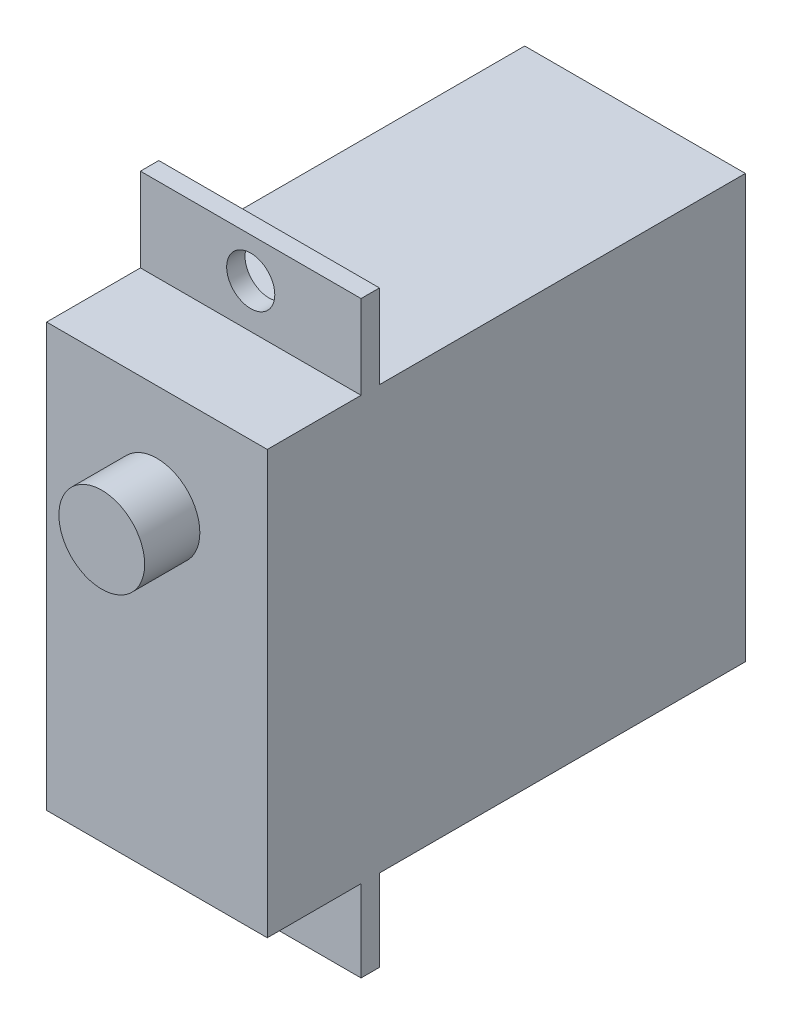
ISO-10303-21;
HEADER;
FILE_DESCRIPTION(('STEP AP214'),'2;1');
FILE_NAME('part.step','',(''),(''),'','','');
FILE_SCHEMA(('AUTOMOTIVE_DESIGN { 1 0 10303 214 1 1 1 1 }'));
ENDSEC;
DATA;
#1=APPLICATION_CONTEXT('core data for automotive mechanical design processes');
#2=APPLICATION_PROTOCOL_DEFINITION('international standard','automotive_design',2000,#1);
#3=PRODUCT_CONTEXT('',#1,'mechanical');
#4=PRODUCT('Part','Part','',(#3));
#5=PRODUCT_RELATED_PRODUCT_CATEGORY('part','',(#4));
#6=PRODUCT_DEFINITION_FORMATION('','',#4);
#7=PRODUCT_DEFINITION_CONTEXT('part definition',#1,'design');
#8=PRODUCT_DEFINITION('design','',#6,#7);
#9=PRODUCT_DEFINITION_SHAPE('','',#8);
#10=(LENGTH_UNIT() NAMED_UNIT(*) SI_UNIT(.MILLI.,.METRE.));
#11=(NAMED_UNIT(*) PLANE_ANGLE_UNIT() SI_UNIT($,.RADIAN.));
#12=(NAMED_UNIT(*) SI_UNIT($,.STERADIAN.) SOLID_ANGLE_UNIT());
#13=UNCERTAINTY_MEASURE_WITH_UNIT(LENGTH_MEASURE(1.E-05),#10,'distance_accuracy_value','');
#14=(GEOMETRIC_REPRESENTATION_CONTEXT(3) GLOBAL_UNCERTAINTY_ASSIGNED_CONTEXT((#13)) GLOBAL_UNIT_ASSIGNED_CONTEXT((#10,
#11,#12)) REPRESENTATION_CONTEXT('',''));
#15=CARTESIAN_POINT('',(0.,0.,0.));
#16=DIRECTION('',(0.,0.,1.));
#17=DIRECTION('',(1.,0.,0.));
#18=AXIS2_PLACEMENT_3D('',#15,#16,#17);
#19=CARTESIAN_POINT('',(-1.4678769771413,-9.63687150837989,26.));
#20=DIRECTION('',(0.,1.,0.));
#21=DIRECTION('',(-1.,0.,0.));
#22=AXIS2_PLACEMENT_3D('',#19,#20,#21);
#23=PLANE('',#22);
#24=DIRECTION('',(0.,0.,-1.));
#25=VECTOR('',#24,1.);
#26=CARTESIAN_POINT('',(10.5321230228587,-9.63687150837989,26.));
#27=LINE('',#26,#25);
#28=CARTESIAN_POINT('',(10.5321230228587,-9.63687150837989,19.9));
#29=VERTEX_POINT('',#28);
#30=CARTESIAN_POINT('',(10.5321230228587,-9.63687150837989,0.));
#31=VERTEX_POINT('',#30);
#32=EDGE_CURVE('E57',#29,#31,#27,.T.);
#33=ORIENTED_EDGE('',*,*,#32,.F.);
#34=DIRECTION('',(-1.,0.,0.));
#35=VECTOR('',#34,1.);
#36=CARTESIAN_POINT('',(-1.4678769771413,-9.63687150837989,19.9));
#37=LINE('',#36,#35);
#38=CARTESIAN_POINT('',(-1.46787697714129,-9.63687150837989,19.9));
#39=VERTEX_POINT('',#38);
#40=EDGE_CURVE('E170',#29,#39,#37,.T.);
#41=ORIENTED_EDGE('',*,*,#40,.T.);
#42=DIRECTION('',(0.,0.,-1.));
#43=VECTOR('',#42,1.);
#44=CARTESIAN_POINT('',(-1.4678769771413,-9.63687150837989,26.));
#45=LINE('',#44,#43);
#46=CARTESIAN_POINT('',(-1.4678769771413,-9.63687150837989,0.));
#47=VERTEX_POINT('',#46);
#48=EDGE_CURVE('E206',#39,#47,#45,.T.);
#49=ORIENTED_EDGE('',*,*,#48,.T.);
#50=DIRECTION('',(1.,0.,0.));
#51=VECTOR('',#50,1.);
#52=CARTESIAN_POINT('',(-1.4678769771413,-9.63687150837989,0.));
#53=LINE('',#52,#51);
#54=EDGE_CURVE('E192',#47,#31,#53,.T.);
#55=ORIENTED_EDGE('',*,*,#54,.T.);
#56=EDGE_LOOP('',(#33,#41,#49,#55));
#57=FACE_BOUND('',#56,.T.);
#58=ADVANCED_FACE('F33',(#57),#23,.F.);
#59=CARTESIAN_POINT('',(-1.4678769771413,13.3631284916201,26.));
#60=DIRECTION('',(0.,-1.,0.));
#61=DIRECTION('',(0.,0.,-1.));
#62=AXIS2_PLACEMENT_3D('',#59,#60,#61);
#63=PLANE('',#62);
#64=DIRECTION('',(0.,0.,-1.));
#65=VECTOR('',#64,1.);
#66=CARTESIAN_POINT('',(-1.4678769771413,13.3631284916201,26.));
#67=LINE('',#66,#65);
#68=CARTESIAN_POINT('',(-1.4678769771413,13.3631284916201,19.9));
#69=VERTEX_POINT('',#68);
#70=CARTESIAN_POINT('',(-1.4678769771413,13.3631284916201,0.));
#71=VERTEX_POINT('',#70);
#72=EDGE_CURVE('E189',#69,#71,#67,.T.);
#73=ORIENTED_EDGE('',*,*,#72,.F.);
#74=DIRECTION('',(1.,0.,0.));
#75=VECTOR('',#74,1.);
#76=CARTESIAN_POINT('',(-1.4678769771413,13.3631284916201,19.9));
#77=LINE('',#76,#75);
#78=CARTESIAN_POINT('',(10.5321230228587,13.3631284916201,19.9));
#79=VERTEX_POINT('',#78);
#80=EDGE_CURVE('E11',#69,#79,#77,.T.);
#81=ORIENTED_EDGE('',*,*,#80,.T.);
#82=DIRECTION('',(0.,0.,-1.));
#83=VECTOR('',#82,1.);
#84=CARTESIAN_POINT('',(10.5321230228587,13.3631284916201,26.));
#85=LINE('',#84,#83);
#86=CARTESIAN_POINT('',(10.5321230228587,13.3631284916201,0.));
#87=VERTEX_POINT('',#86);
#88=EDGE_CURVE('E132',#79,#87,#85,.T.);
#89=ORIENTED_EDGE('',*,*,#88,.T.);
#90=DIRECTION('',(-1.,0.,0.));
#91=VECTOR('',#90,1.);
#92=CARTESIAN_POINT('',(-1.4678769771413,13.3631284916201,0.));
#93=LINE('',#92,#91);
#94=EDGE_CURVE('E183',#87,#71,#93,.T.);
#95=ORIENTED_EDGE('',*,*,#94,.T.);
#96=EDGE_LOOP('',(#73,#81,#89,#95));
#97=FACE_BOUND('',#96,.T.);
#98=ADVANCED_FACE('F226',(#97),#63,.F.);
#99=CARTESIAN_POINT('',(-1.4678769771413,13.3631284916201,26.));
#100=DIRECTION('',(1.,0.,0.));
#101=DIRECTION('',(0.,1.,0.));
#102=AXIS2_PLACEMENT_3D('',#99,#100,#101);
#103=PLANE('',#102);
#104=CARTESIAN_POINT('',(-1.4678769771413,13.3631284916201,26.));
#105=VERTEX_POINT('',#104);
#106=CARTESIAN_POINT('',(-1.4678769771413,13.3631284916201,20.9));
#107=VERTEX_POINT('',#106);
#108=EDGE_CURVE('E198',#105,#107,#67,.T.);
#109=ORIENTED_EDGE('',*,*,#108,.T.);
#110=DIRECTION('',(0.,1.,0.));
#111=VECTOR('',#110,1.);
#112=CARTESIAN_POINT('',(-1.4678769771413,17.9199885826736,20.9));
#113=LINE('',#112,#111);
#114=CARTESIAN_POINT('',(-1.4678769771413,17.9199885826736,20.9));
#115=VERTEX_POINT('',#114);
#116=EDGE_CURVE('E161',#107,#115,#113,.T.);
#117=ORIENTED_EDGE('',*,*,#116,.T.);
#118=DIRECTION('',(0.,0.,-1.));
#119=VECTOR('',#118,1.);
#120=CARTESIAN_POINT('',(-1.4678769771413,17.9199885826736,20.9));
#121=LINE('',#120,#119);
#122=CARTESIAN_POINT('',(-1.4678769771413,17.9199885826736,19.9));
#123=VERTEX_POINT('',#122);
#124=EDGE_CURVE('E166',#115,#123,#121,.T.);
#125=ORIENTED_EDGE('',*,*,#124,.T.);
#126=DIRECTION('',(0.,-1.,0.));
#127=VECTOR('',#126,1.);
#128=CARTESIAN_POINT('',(-1.4678769771413,17.9199885826736,19.9));
#129=LINE('',#128,#127);
#130=EDGE_CURVE('E141',#123,#69,#129,.T.);
#131=ORIENTED_EDGE('',*,*,#130,.T.);
#132=ORIENTED_EDGE('',*,*,#72,.T.);
#133=DIRECTION('',(0.,-1.,0.));
#134=VECTOR('',#133,1.);
#135=CARTESIAN_POINT('',(-1.4678769771413,13.3631284916201,0.));
#136=LINE('',#135,#134);
#137=EDGE_CURVE('E176',#71,#47,#136,.T.);
#138=ORIENTED_EDGE('',*,*,#137,.T.);
#139=ORIENTED_EDGE('',*,*,#48,.F.);
#140=CARTESIAN_POINT('',(-1.4678769771413,-14.0800114173264,19.9));
#141=VERTEX_POINT('',#140);
#142=EDGE_CURVE('E224',#39,#141,#129,.T.);
#143=ORIENTED_EDGE('',*,*,#142,.T.);
#144=DIRECTION('',(0.,0.,1.));
#145=VECTOR('',#144,1.);
#146=CARTESIAN_POINT('',(-1.4678769771413,-14.0800114173264,20.9));
#147=LINE('',#146,#145);
#148=CARTESIAN_POINT('',(-1.46787697714129,-14.0800114173264,20.9));
#149=VERTEX_POINT('',#148);
#150=EDGE_CURVE('E239',#141,#149,#147,.T.);
#151=ORIENTED_EDGE('',*,*,#150,.T.);
#152=CARTESIAN_POINT('',(-1.4678769771413,-9.63687150837989,20.9));
#153=VERTEX_POINT('',#152);
#154=EDGE_CURVE('E240',#149,#153,#113,.T.);
#155=ORIENTED_EDGE('',*,*,#154,.T.);
#156=CARTESIAN_POINT('',(-1.4678769771413,-9.63687150837989,26.));
#157=VERTEX_POINT('',#156);
#158=EDGE_CURVE('E49',#157,#153,#45,.T.);
#159=ORIENTED_EDGE('',*,*,#158,.F.);
#160=DIRECTION('',(0.,-1.,0.));
#161=VECTOR('',#160,1.);
#162=CARTESIAN_POINT('',(-1.4678769771413,13.3631284916201,26.));
#163=LINE('',#162,#161);
#164=EDGE_CURVE('E179',#105,#157,#163,.T.);
#165=ORIENTED_EDGE('',*,*,#164,.F.);
#166=EDGE_LOOP('',(#109,#117,#125,#131,#132,#138,#139,#143,#151,#155,#159,#165));
#167=FACE_BOUND('',#166,.T.);
#168=ADVANCED_FACE('F35',(#167),#103,.F.);
#169=ORIENTED_EDGE('',*,*,#158,.T.);
#170=DIRECTION('',(1.,0.,0.));
#171=VECTOR('',#170,1.);
#172=CARTESIAN_POINT('',(-1.4678769771413,-9.63687150837989,20.9));
#173=LINE('',#172,#171);
#174=CARTESIAN_POINT('',(10.5321230228587,-9.63687150837989,20.9));
#175=VERTEX_POINT('',#174);
#176=EDGE_CURVE('E168',#153,#175,#173,.T.);
#177=ORIENTED_EDGE('',*,*,#176,.T.);
#178=CARTESIAN_POINT('',(10.5321230228587,-9.63687150837989,26.));
#179=VERTEX_POINT('',#178);
#180=EDGE_CURVE('E204',#179,#175,#27,.T.);
#181=ORIENTED_EDGE('',*,*,#180,.F.);
#182=DIRECTION('',(1.,0.,0.));
#183=VECTOR('',#182,1.);
#184=CARTESIAN_POINT('',(-1.4678769771413,-9.63687150837989,26.));
#185=LINE('',#184,#183);
#186=EDGE_CURVE('E182',#157,#179,#185,.T.);
#187=ORIENTED_EDGE('',*,*,#186,.F.);
#188=EDGE_LOOP('',(#169,#177,#181,#187));
#189=FACE_BOUND('',#188,.T.);
#190=ADVANCED_FACE('F273',(#189),#23,.F.);
#191=CARTESIAN_POINT('',(10.5321230228587,13.3631284916201,26.));
#192=DIRECTION('',(-1.,0.,0.));
#193=DIRECTION('',(0.,0.,1.));
#194=AXIS2_PLACEMENT_3D('',#191,#192,#193);
#195=PLANE('',#194);
#196=ORIENTED_EDGE('',*,*,#180,.T.);
#197=DIRECTION('',(0.,-1.,0.));
#198=VECTOR('',#197,1.);
#199=CARTESIAN_POINT('',(10.5321230228587,17.9199885826736,20.9));
#200=LINE('',#199,#198);
#201=CARTESIAN_POINT('',(10.5321230228587,-14.0800114173264,20.9));
#202=VERTEX_POINT('',#201);
#203=EDGE_CURVE('E150',#175,#202,#200,.T.);
#204=ORIENTED_EDGE('',*,*,#203,.T.);
#205=DIRECTION('',(0.,0.,-1.));
#206=VECTOR('',#205,1.);
#207=CARTESIAN_POINT('',(10.5321230228587,-14.0800114173264,20.9));
#208=LINE('',#207,#206);
#209=CARTESIAN_POINT('',(10.5321230228587,-14.0800114173264,19.9));
#210=VERTEX_POINT('',#209);
#211=EDGE_CURVE('E145',#202,#210,#208,.T.);
#212=ORIENTED_EDGE('',*,*,#211,.T.);
#213=DIRECTION('',(0.,1.,0.));
#214=VECTOR('',#213,1.);
#215=CARTESIAN_POINT('',(10.5321230228587,17.9199885826736,19.9));
#216=LINE('',#215,#214);
#217=EDGE_CURVE('E135',#210,#29,#216,.T.);
#218=ORIENTED_EDGE('',*,*,#217,.T.);
#219=ORIENTED_EDGE('',*,*,#32,.T.);
#220=DIRECTION('',(0.,1.,0.));
#221=VECTOR('',#220,1.);
#222=CARTESIAN_POINT('',(10.5321230228587,13.3631284916201,0.));
#223=LINE('',#222,#221);
#224=EDGE_CURVE('E194',#31,#87,#223,.T.);
#225=ORIENTED_EDGE('',*,*,#224,.T.);
#226=ORIENTED_EDGE('',*,*,#88,.F.);
#227=CARTESIAN_POINT('',(10.5321230228587,17.9199885826736,19.9));
#228=VERTEX_POINT('',#227);
#229=EDGE_CURVE('E124',#79,#228,#216,.T.);
#230=ORIENTED_EDGE('',*,*,#229,.T.);
#231=DIRECTION('',(0.,0.,1.));
#232=VECTOR('',#231,1.);
#233=CARTESIAN_POINT('',(10.5321230228587,17.9199885826736,20.9));
#234=LINE('',#233,#232);
#235=CARTESIAN_POINT('',(10.5321230228587,17.9199885826736,20.9));
#236=VERTEX_POINT('',#235);
#237=EDGE_CURVE('E130',#228,#236,#234,.T.);
#238=ORIENTED_EDGE('',*,*,#237,.T.);
#239=CARTESIAN_POINT('',(10.5321230228587,13.3631284916201,20.9));
#240=VERTEX_POINT('',#239);
#241=EDGE_CURVE('E152',#236,#240,#200,.T.);
#242=ORIENTED_EDGE('',*,*,#241,.T.);
#243=CARTESIAN_POINT('',(10.5321230228587,13.3631284916201,26.));
#244=VERTEX_POINT('',#243);
#245=EDGE_CURVE('E201',#244,#240,#85,.T.);
#246=ORIENTED_EDGE('',*,*,#245,.F.);
#247=DIRECTION('',(0.,1.,0.));
#248=VECTOR('',#247,1.);
#249=CARTESIAN_POINT('',(10.5321230228587,13.3631284916201,26.));
#250=LINE('',#249,#248);
#251=EDGE_CURVE('E185',#179,#244,#250,.T.);
#252=ORIENTED_EDGE('',*,*,#251,.F.);
#253=EDGE_LOOP('',(#196,#204,#212,#218,#219,#225,#226,#230,#238,#242,#246,#252));
#254=FACE_BOUND('',#253,.T.);
#255=ADVANCED_FACE('F127',(#254),#195,.F.);
#256=ORIENTED_EDGE('',*,*,#245,.T.);
#257=DIRECTION('',(-1.,0.,0.));
#258=VECTOR('',#257,1.);
#259=CARTESIAN_POINT('',(-1.4678769771413,13.3631284916201,20.9));
#260=LINE('',#259,#258);
#261=EDGE_CURVE('E42',#240,#107,#260,.T.);
#262=ORIENTED_EDGE('',*,*,#261,.T.);
#263=ORIENTED_EDGE('',*,*,#108,.F.);
#264=DIRECTION('',(-1.,0.,0.));
#265=VECTOR('',#264,1.);
#266=CARTESIAN_POINT('',(-1.4678769771413,13.3631284916201,26.));
#267=LINE('',#266,#265);
#268=EDGE_CURVE('E187',#244,#105,#267,.T.);
#269=ORIENTED_EDGE('',*,*,#268,.F.);
#270=EDGE_LOOP('',(#256,#262,#263,#269));
#271=FACE_BOUND('',#270,.T.);
#272=ADVANCED_FACE('F211',(#271),#63,.F.);
#273=CARTESIAN_POINT('',(0.,0.,26.));
#274=DIRECTION('',(0.,0.,1.));
#275=DIRECTION('',(1.,0.,0.));
#276=AXIS2_PLACEMENT_3D('',#273,#274,#275);
#277=PLANE('',#276);
#278=CARTESIAN_POINT('',(4.5321230228587,7.61312849162011,26.));
#279=DIRECTION('',(0.,0.,1.));
#280=DIRECTION('',(1.,0.,0.));
#281=AXIS2_PLACEMENT_3D('',#278,#279,#280);
#282=CIRCLE('',#281,2.33274026674224);
#283=CARTESIAN_POINT('',(6.86486328960094,7.61312849162011,26.));
#284=VERTEX_POINT('',#283);
#285=EDGE_CURVE('E172',#284,#284,#282,.T.);
#286=ORIENTED_EDGE('',*,*,#285,.F.);
#287=EDGE_LOOP('',(#286));
#288=FACE_BOUND('',#287,.T.);
#289=ORIENTED_EDGE('',*,*,#164,.T.);
#290=ORIENTED_EDGE('',*,*,#186,.T.);
#291=ORIENTED_EDGE('',*,*,#251,.T.);
#292=ORIENTED_EDGE('',*,*,#268,.T.);
#293=EDGE_LOOP('',(#289,#290,#291,#292));
#294=FACE_BOUND('',#293,.T.);
#295=ADVANCED_FACE('F219',(#288,#294),#277,.T.);
#296=CARTESIAN_POINT('',(0.,0.,0.));
#297=DIRECTION('',(0.,0.,1.));
#298=DIRECTION('',(1.,0.,0.));
#299=AXIS2_PLACEMENT_3D('',#296,#297,#298);
#300=PLANE('',#299);
#301=ORIENTED_EDGE('',*,*,#137,.F.);
#302=ORIENTED_EDGE('',*,*,#94,.F.);
#303=ORIENTED_EDGE('',*,*,#224,.F.);
#304=ORIENTED_EDGE('',*,*,#54,.F.);
#305=EDGE_LOOP('',(#301,#302,#303,#304));
#306=FACE_BOUND('',#305,.T.);
#307=ADVANCED_FACE('F232',(#306),#300,.F.);
#308=CARTESIAN_POINT('',(4.5321230228587,7.61312849162011,29.));
#309=DIRECTION('',(0.,0.,-1.));
#310=DIRECTION('',(-1.,0.,0.));
#311=AXIS2_PLACEMENT_3D('',#308,#309,#310);
#312=CYLINDRICAL_SURFACE('',#311,2.33274026674224);
#313=CARTESIAN_POINT('',(4.5321230228587,7.61312849162011,29.));
#314=DIRECTION('',(0.,0.,1.));
#315=DIRECTION('',(1.,0.,0.));
#316=AXIS2_PLACEMENT_3D('',#313,#314,#315);
#317=CIRCLE('',#316,2.33274026674224);
#318=CARTESIAN_POINT('',(6.86486328960094,7.61312849162011,29.));
#319=VERTEX_POINT('',#318);
#320=EDGE_CURVE('E173',#319,#319,#317,.T.);
#321=ORIENTED_EDGE('',*,*,#320,.F.);
#322=EDGE_LOOP('',(#321));
#323=FACE_BOUND('',#322,.T.);
#324=ORIENTED_EDGE('',*,*,#285,.T.);
#325=EDGE_LOOP('',(#324));
#326=FACE_BOUND('',#325,.T.);
#327=ADVANCED_FACE('F364',(#323,#326),#312,.T.);
#328=CARTESIAN_POINT('',(4.5321230228587,7.61312849162011,29.));
#329=DIRECTION('',(0.,0.,1.));
#330=DIRECTION('',(1.,0.,0.));
#331=AXIS2_PLACEMENT_3D('',#328,#329,#330);
#332=PLANE('',#331);
#333=ORIENTED_EDGE('',*,*,#320,.T.);
#334=EDGE_LOOP('',(#333));
#335=FACE_BOUND('',#334,.T.);
#336=ADVANCED_FACE('F266',(#335),#332,.T.);
#337=CARTESIAN_POINT('',(-33.4834981643055,17.9199885826736,20.9));
#338=DIRECTION('',(0.,1.,0.));
#339=DIRECTION('',(0.,0.,1.));
#340=AXIS2_PLACEMENT_3D('',#337,#338,#339);
#341=PLANE('',#340);
#342=ORIENTED_EDGE('',*,*,#124,.F.);
#343=DIRECTION('',(1.,0.,0.));
#344=VECTOR('',#343,1.);
#345=CARTESIAN_POINT('',(-33.4834981643055,17.9199885826736,20.9));
#346=LINE('',#345,#344);
#347=EDGE_CURVE('E144',#115,#236,#346,.T.);
#348=ORIENTED_EDGE('',*,*,#347,.T.);
#349=ORIENTED_EDGE('',*,*,#237,.F.);
#350=DIRECTION('',(1.,0.,0.));
#351=VECTOR('',#350,1.);
#352=CARTESIAN_POINT('',(-33.4834981643055,17.9199885826736,19.9));
#353=LINE('',#352,#351);
#354=EDGE_CURVE('E139',#123,#228,#353,.T.);
#355=ORIENTED_EDGE('',*,*,#354,.F.);
#356=EDGE_LOOP('',(#342,#348,#349,#355));
#357=FACE_BOUND('',#356,.T.);
#358=ADVANCED_FACE('F147',(#357),#341,.T.);
#359=CARTESIAN_POINT('',(-33.4834981643055,17.9199885826736,20.9));
#360=DIRECTION('',(0.,0.,1.));
#361=DIRECTION('',(1.,0.,0.));
#362=AXIS2_PLACEMENT_3D('',#359,#360,#361);
#363=PLANE('',#362);
#364=CARTESIAN_POINT('',(4.5321230228587,15.753010851995,20.9));
#365=DIRECTION('',(0.,0.,1.));
#366=DIRECTION('',(1.,0.,0.));
#367=AXIS2_PLACEMENT_3D('',#364,#365,#366);
#368=CIRCLE('',#367,1.30831626430956);
#369=CARTESIAN_POINT('',(5.84043928716826,15.753010851995,20.9));
#370=VERTEX_POINT('',#369);
#371=EDGE_CURVE('E247',#370,#370,#368,.T.);
#372=ORIENTED_EDGE('',*,*,#371,.F.);
#373=EDGE_LOOP('',(#372));
#374=FACE_BOUND('',#373,.T.);
#375=ORIENTED_EDGE('',*,*,#261,.F.);
#376=ORIENTED_EDGE('',*,*,#241,.F.);
#377=ORIENTED_EDGE('',*,*,#347,.F.);
#378=ORIENTED_EDGE('',*,*,#116,.F.);
#379=EDGE_LOOP('',(#375,#376,#377,#378));
#380=FACE_BOUND('',#379,.T.);
#381=ADVANCED_FACE('F222',(#374,#380),#363,.T.);
#382=CARTESIAN_POINT('',(-33.4834981643055,17.9199885826736,19.9));
#383=DIRECTION('',(0.,0.,-1.));
#384=DIRECTION('',(-1.,0.,0.));
#385=AXIS2_PLACEMENT_3D('',#382,#383,#384);
#386=PLANE('',#385);
#387=CARTESIAN_POINT('',(4.5321230228587,15.753010851995,19.9));
#388=DIRECTION('',(0.,0.,-1.));
#389=DIRECTION('',(-1.,0.,0.));
#390=AXIS2_PLACEMENT_3D('',#387,#388,#389);
#391=CIRCLE('',#390,1.30831626430956);
#392=CARTESIAN_POINT('',(3.22380675854914,15.753010851995,19.9));
#393=VERTEX_POINT('',#392);
#394=EDGE_CURVE('E37',#393,#393,#391,.T.);
#395=ORIENTED_EDGE('',*,*,#394,.F.);
#396=EDGE_LOOP('',(#395));
#397=FACE_BOUND('',#396,.T.);
#398=ORIENTED_EDGE('',*,*,#80,.F.);
#399=ORIENTED_EDGE('',*,*,#130,.F.);
#400=ORIENTED_EDGE('',*,*,#354,.T.);
#401=ORIENTED_EDGE('',*,*,#229,.F.);
#402=EDGE_LOOP('',(#398,#399,#400,#401));
#403=FACE_BOUND('',#402,.T.);
#404=ADVANCED_FACE('F140',(#397,#403),#386,.T.);
#405=CARTESIAN_POINT('',(4.5321230228587,-11.8278866581818,19.9));
#406=DIRECTION('',(0.,0.,-1.));
#407=DIRECTION('',(-1.,0.,0.));
#408=AXIS2_PLACEMENT_3D('',#405,#406,#407);
#409=CIRCLE('',#408,1.22970194022628);
#410=CARTESIAN_POINT('',(3.30242108263242,-11.8278866581818,19.9));
#411=VERTEX_POINT('',#410);
#412=EDGE_CURVE('E244',#411,#411,#409,.T.);
#413=ORIENTED_EDGE('',*,*,#412,.F.);
#414=EDGE_LOOP('',(#413));
#415=FACE_BOUND('',#414,.T.);
#416=ORIENTED_EDGE('',*,*,#40,.F.);
#417=ORIENTED_EDGE('',*,*,#217,.F.);
#418=DIRECTION('',(1.,0.,0.));
#419=VECTOR('',#418,1.);
#420=CARTESIAN_POINT('',(-33.4834981643055,-14.0800114173264,19.9));
#421=LINE('',#420,#419);
#422=EDGE_CURVE('E159',#141,#210,#421,.T.);
#423=ORIENTED_EDGE('',*,*,#422,.F.);
#424=ORIENTED_EDGE('',*,*,#142,.F.);
#425=EDGE_LOOP('',(#416,#417,#423,#424));
#426=FACE_BOUND('',#425,.T.);
#427=ADVANCED_FACE('F238',(#415,#426),#386,.T.);
#428=CARTESIAN_POINT('',(4.5321230228587,-11.8278866581818,20.9));
#429=DIRECTION('',(0.,0.,1.));
#430=DIRECTION('',(1.,0.,0.));
#431=AXIS2_PLACEMENT_3D('',#428,#429,#430);
#432=CIRCLE('',#431,1.22970194022628);
#433=CARTESIAN_POINT('',(5.76182496308498,-11.8278866581818,20.9));
#434=VERTEX_POINT('',#433);
#435=EDGE_CURVE('E248',#434,#434,#432,.T.);
#436=ORIENTED_EDGE('',*,*,#435,.F.);
#437=EDGE_LOOP('',(#436));
#438=FACE_BOUND('',#437,.T.);
#439=ORIENTED_EDGE('',*,*,#176,.F.);
#440=ORIENTED_EDGE('',*,*,#154,.F.);
#441=DIRECTION('',(1.,0.,0.));
#442=VECTOR('',#441,1.);
#443=CARTESIAN_POINT('',(-33.4834981643055,-14.0800114173264,20.9));
#444=LINE('',#443,#442);
#445=EDGE_CURVE('E162',#149,#202,#444,.T.);
#446=ORIENTED_EDGE('',*,*,#445,.T.);
#447=ORIENTED_EDGE('',*,*,#203,.F.);
#448=EDGE_LOOP('',(#439,#440,#446,#447));
#449=FACE_BOUND('',#448,.T.);
#450=ADVANCED_FACE('F258',(#438,#449),#363,.T.);
#451=CARTESIAN_POINT('',(-33.4834981643055,-14.0800114173264,20.9));
#452=DIRECTION('',(0.,-1.,0.));
#453=DIRECTION('',(0.,0.,-1.));
#454=AXIS2_PLACEMENT_3D('',#451,#452,#453);
#455=PLANE('',#454);
#456=ORIENTED_EDGE('',*,*,#150,.F.);
#457=ORIENTED_EDGE('',*,*,#422,.T.);
#458=ORIENTED_EDGE('',*,*,#211,.F.);
#459=ORIENTED_EDGE('',*,*,#445,.F.);
#460=EDGE_LOOP('',(#456,#457,#458,#459));
#461=FACE_BOUND('',#460,.T.);
#462=ADVANCED_FACE('F270',(#461),#455,.T.);
#463=CARTESIAN_POINT('',(4.5321230228587,-11.8278866581818,10.9));
#464=DIRECTION('',(0.,0.,1.));
#465=DIRECTION('',(1.,0.,0.));
#466=AXIS2_PLACEMENT_3D('',#463,#464,#465);
#467=CYLINDRICAL_SURFACE('',#466,1.22970194022628);
#468=ORIENTED_EDGE('',*,*,#412,.T.);
#469=EDGE_LOOP('',(#468));
#470=FACE_BOUND('',#469,.T.);
#471=ORIENTED_EDGE('',*,*,#435,.T.);
#472=EDGE_LOOP('',(#471));
#473=FACE_BOUND('',#472,.T.);
#474=ADVANCED_FACE('F330',(#470,#473),#467,.F.);
#475=CARTESIAN_POINT('',(4.5321230228587,15.753010851995,10.9));
#476=DIRECTION('',(0.,0.,1.));
#477=DIRECTION('',(1.,0.,0.));
#478=AXIS2_PLACEMENT_3D('',#475,#476,#477);
#479=CYLINDRICAL_SURFACE('',#478,1.30831626430956);
#480=ORIENTED_EDGE('',*,*,#394,.T.);
#481=EDGE_LOOP('',(#480));
#482=FACE_BOUND('',#481,.T.);
#483=ORIENTED_EDGE('',*,*,#371,.T.);
#484=EDGE_LOOP('',(#483));
#485=FACE_BOUND('',#484,.T.);
#486=ADVANCED_FACE('F254',(#482,#485),#479,.F.);
#487=CLOSED_SHELL('',(#58,#98,#168,#190,#255,#272,#295,#307,#327,#336,#358,#381,#404,#427,#450,
#462,#474,#486));
#488=MANIFOLD_SOLID_BREP('B2',#487);
#489=ADVANCED_BREP_SHAPE_REPRESENTATION('',(#18,#488),#14);
#490=SHAPE_DEFINITION_REPRESENTATION(#9,#489);
ENDSEC;
END-ISO-10303-21;
